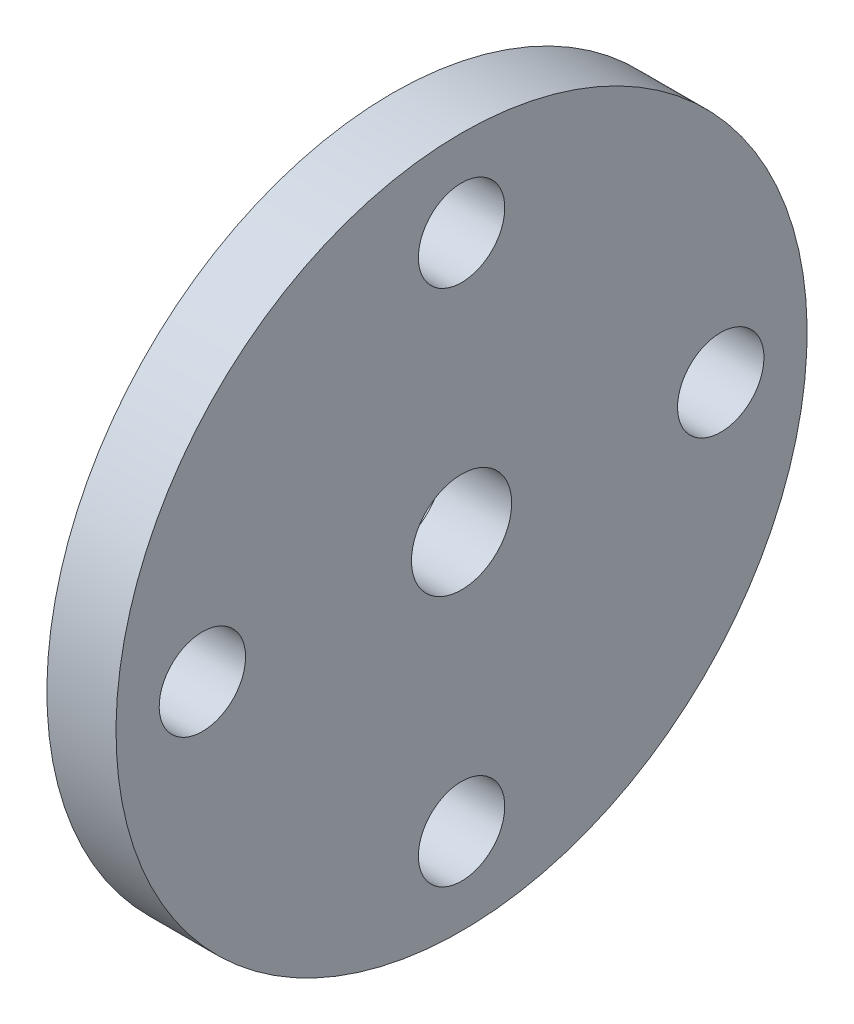
ISO-10303-21;
HEADER;
FILE_DESCRIPTION(('STEP AP214'),'2;1');
FILE_NAME('part.step','',(''),(''),'','','');
FILE_SCHEMA(('AUTOMOTIVE_DESIGN { 1 0 10303 214 1 1 1 1 }'));
ENDSEC;
DATA;
#1=APPLICATION_CONTEXT('core data for automotive mechanical design processes');
#2=APPLICATION_PROTOCOL_DEFINITION('international standard','automotive_design',2000,#1);
#3=PRODUCT_CONTEXT('',#1,'mechanical');
#4=PRODUCT('Part','Part','',(#3));
#5=PRODUCT_RELATED_PRODUCT_CATEGORY('part','',(#4));
#6=PRODUCT_DEFINITION_FORMATION('','',#4);
#7=PRODUCT_DEFINITION_CONTEXT('part definition',#1,'design');
#8=PRODUCT_DEFINITION('design','',#6,#7);
#9=PRODUCT_DEFINITION_SHAPE('','',#8);
#10=(LENGTH_UNIT() NAMED_UNIT(*) SI_UNIT(.MILLI.,.METRE.));
#11=(NAMED_UNIT(*) PLANE_ANGLE_UNIT() SI_UNIT($,.RADIAN.));
#12=(NAMED_UNIT(*) SI_UNIT($,.STERADIAN.) SOLID_ANGLE_UNIT());
#13=UNCERTAINTY_MEASURE_WITH_UNIT(LENGTH_MEASURE(1.E-05),#10,'distance_accuracy_value','');
#14=(GEOMETRIC_REPRESENTATION_CONTEXT(3) GLOBAL_UNCERTAINTY_ASSIGNED_CONTEXT((#13)) GLOBAL_UNIT_ASSIGNED_CONTEXT((#10,
#11,#12)) REPRESENTATION_CONTEXT('',''));
#15=CARTESIAN_POINT('',(0.,0.,0.));
#16=DIRECTION('',(0.,0.,1.));
#17=DIRECTION('',(1.,0.,0.));
#18=AXIS2_PLACEMENT_3D('',#15,#16,#17);
#19=CARTESIAN_POINT('',(5.,0.,0.));
#20=DIRECTION('',(1.,0.,0.));
#21=DIRECTION('',(0.,1.,0.));
#22=AXIS2_PLACEMENT_3D('',#19,#20,#21);
#23=CYLINDRICAL_SURFACE('',#22,4.7);
#24=CARTESIAN_POINT('',(0.,0.,0.));
#25=DIRECTION('',(1.,0.,0.));
#26=DIRECTION('',(0.,1.,0.));
#27=AXIS2_PLACEMENT_3D('',#24,#25,#26);
#28=CIRCLE('',#27,4.7);
#29=CARTESIAN_POINT('',(0.,4.7,0.));
#30=VERTEX_POINT('',#29);
#31=EDGE_CURVE('E10',#30,#30,#28,.T.);
#32=ORIENTED_EDGE('',*,*,#31,.T.);
#33=EDGE_LOOP('',(#32));
#34=FACE_BOUND('',#33,.T.);
#35=CARTESIAN_POINT('',(3.,0.,0.));
#36=DIRECTION('',(1.,0.,0.));
#37=DIRECTION('',(0.,1.,0.));
#38=AXIS2_PLACEMENT_3D('',#35,#36,#37);
#39=CIRCLE('',#38,4.7);
#40=CARTESIAN_POINT('',(3.,4.7,0.));
#41=VERTEX_POINT('',#40);
#42=EDGE_CURVE('E62',#41,#41,#39,.T.);
#43=ORIENTED_EDGE('',*,*,#42,.F.);
#44=EDGE_LOOP('',(#43));
#45=FACE_BOUND('',#44,.T.);
#46=ADVANCED_FACE('F31',(#34,#45),#23,.T.);
#47=CARTESIAN_POINT('',(0.,3.,0.));
#48=DIRECTION('',(-1.,0.,0.));
#49=DIRECTION('',(0.,-1.,0.));
#50=AXIS2_PLACEMENT_3D('',#47,#48,#49);
#51=PLANE('',#50);
#52=CARTESIAN_POINT('',(0.,0.,0.));
#53=DIRECTION('',(1.,0.,0.));
#54=DIRECTION('',(0.,1.,0.));
#55=AXIS2_PLACEMENT_3D('',#52,#53,#54);
#56=CIRCLE('',#55,3.);
#57=CARTESIAN_POINT('',(0.,3.,0.));
#58=VERTEX_POINT('',#57);
#59=EDGE_CURVE('E38',#58,#58,#56,.T.);
#60=ORIENTED_EDGE('',*,*,#59,.T.);
#61=EDGE_LOOP('',(#60));
#62=FACE_BOUND('',#61,.T.);
#63=ORIENTED_EDGE('',*,*,#31,.F.);
#64=EDGE_LOOP('',(#63));
#65=FACE_BOUND('',#64,.T.);
#66=ADVANCED_FACE('F94',(#62,#65),#51,.T.);
#67=CARTESIAN_POINT('',(5.,0.,0.));
#68=DIRECTION('',(1.,0.,0.));
#69=DIRECTION('',(0.,1.,0.));
#70=AXIS2_PLACEMENT_3D('',#67,#68,#69);
#71=CYLINDRICAL_SURFACE('',#70,3.);
#72=CARTESIAN_POINT('',(3.,0.,0.));
#73=DIRECTION('',(1.,0.,0.));
#74=DIRECTION('',(0.,1.,0.));
#75=AXIS2_PLACEMENT_3D('',#72,#73,#74);
#76=CIRCLE('',#75,3.);
#77=CARTESIAN_POINT('',(3.,3.,0.));
#78=VERTEX_POINT('',#77);
#79=EDGE_CURVE('E43',#78,#78,#76,.T.);
#80=ORIENTED_EDGE('',*,*,#79,.T.);
#81=EDGE_LOOP('',(#80));
#82=FACE_BOUND('',#81,.T.);
#83=ORIENTED_EDGE('',*,*,#59,.F.);
#84=EDGE_LOOP('',(#83));
#85=FACE_BOUND('',#84,.T.);
#86=ADVANCED_FACE('F79',(#82,#85),#71,.F.);
#87=CARTESIAN_POINT('',(3.,3.,0.));
#88=DIRECTION('',(-1.,0.,0.));
#89=DIRECTION('',(0.,-1.,0.));
#90=AXIS2_PLACEMENT_3D('',#87,#88,#89);
#91=PLANE('',#90);
#92=CARTESIAN_POINT('',(3.,0.,0.));
#93=DIRECTION('',(-1.,0.,0.));
#94=DIRECTION('',(0.,-1.,0.));
#95=AXIS2_PLACEMENT_3D('',#92,#93,#94);
#96=CIRCLE('',#95,1.45);
#97=CARTESIAN_POINT('',(3.,-1.45,0.));
#98=VERTEX_POINT('',#97);
#99=EDGE_CURVE('E58',#98,#98,#96,.T.);
#100=ORIENTED_EDGE('',*,*,#99,.F.);
#101=EDGE_LOOP('',(#100));
#102=FACE_BOUND('',#101,.T.);
#103=ORIENTED_EDGE('',*,*,#79,.F.);
#104=EDGE_LOOP('',(#103));
#105=FACE_BOUND('',#104,.T.);
#106=ADVANCED_FACE('F82',(#102,#105),#91,.T.);
#107=CARTESIAN_POINT('',(5.,10.,0.));
#108=DIRECTION('',(1.,0.,0.));
#109=DIRECTION('',(0.,1.,0.));
#110=AXIS2_PLACEMENT_3D('',#107,#108,#109);
#111=PLANE('',#110);
#112=CARTESIAN_POINT('',(5.,7.5,0.));
#113=DIRECTION('',(1.,0.,0.));
#114=DIRECTION('',(0.,1.,0.));
#115=AXIS2_PLACEMENT_3D('',#112,#113,#114);
#116=CIRCLE('',#115,1.25);
#117=CARTESIAN_POINT('',(5.,8.75,0.));
#118=VERTEX_POINT('',#117);
#119=EDGE_CURVE('E147',#118,#118,#116,.T.);
#120=ORIENTED_EDGE('',*,*,#119,.F.);
#121=EDGE_LOOP('',(#120));
#122=FACE_BOUND('',#121,.T.);
#123=CARTESIAN_POINT('',(5.,2.13328537801155E-13,-7.50000000000021));
#124=DIRECTION('',(1.,0.,0.));
#125=DIRECTION('',(0.,1.,0.));
#126=AXIS2_PLACEMENT_3D('',#123,#124,#125);
#127=CIRCLE('',#126,1.25000000000017);
#128=CARTESIAN_POINT('',(5.,1.25000000000038,-7.50000000000021));
#129=VERTEX_POINT('',#128);
#130=EDGE_CURVE('E143',#129,#129,#127,.T.);
#131=ORIENTED_EDGE('',*,*,#130,.F.);
#132=EDGE_LOOP('',(#131));
#133=FACE_BOUND('',#132,.T.);
#134=CARTESIAN_POINT('',(5.,-7.5,-4.24488671257339E-13));
#135=DIRECTION('',(1.,0.,0.));
#136=DIRECTION('',(0.,1.,0.));
#137=AXIS2_PLACEMENT_3D('',#134,#135,#136);
#138=CIRCLE('',#137,1.25000000000046);
#139=CARTESIAN_POINT('',(5.,-6.24999999999954,-4.24488671257339E-13));
#140=VERTEX_POINT('',#139);
#141=EDGE_CURVE('E141',#140,#140,#138,.T.);
#142=ORIENTED_EDGE('',*,*,#141,.F.);
#143=EDGE_LOOP('',(#142));
#144=FACE_BOUND('',#143,.T.);
#145=CARTESIAN_POINT('',(5.,-2.12078618555545E-13,7.49999999999979));
#146=DIRECTION('',(1.,0.,0.));
#147=DIRECTION('',(0.,1.,0.));
#148=AXIS2_PLACEMENT_3D('',#145,#146,#147);
#149=CIRCLE('',#148,1.25000000000034);
#150=CARTESIAN_POINT('',(5.,1.25000000000013,7.49999999999979));
#151=VERTEX_POINT('',#150);
#152=EDGE_CURVE('E144',#151,#151,#149,.T.);
#153=ORIENTED_EDGE('',*,*,#152,.F.);
#154=EDGE_LOOP('',(#153));
#155=FACE_BOUND('',#154,.T.);
#156=CARTESIAN_POINT('',(5.,0.,0.));
#157=DIRECTION('',(1.,0.,0.));
#158=DIRECTION('',(0.,1.,0.));
#159=AXIS2_PLACEMENT_3D('',#156,#157,#158);
#160=CIRCLE('',#159,1.45);
#161=CARTESIAN_POINT('',(5.,1.45,0.));
#162=VERTEX_POINT('',#161);
#163=EDGE_CURVE('E51',#162,#162,#160,.T.);
#164=ORIENTED_EDGE('',*,*,#163,.F.);
#165=EDGE_LOOP('',(#164));
#166=FACE_BOUND('',#165,.T.);
#167=CARTESIAN_POINT('',(5.,0.,0.));
#168=DIRECTION('',(1.,0.,0.));
#169=DIRECTION('',(0.,1.,0.));
#170=AXIS2_PLACEMENT_3D('',#167,#168,#169);
#171=CIRCLE('',#170,10.);
#172=CARTESIAN_POINT('',(5.,10.,0.));
#173=VERTEX_POINT('',#172);
#174=EDGE_CURVE('E74',#173,#173,#171,.T.);
#175=ORIENTED_EDGE('',*,*,#174,.T.);
#176=EDGE_LOOP('',(#175));
#177=FACE_BOUND('',#176,.T.);
#178=ADVANCED_FACE('F84',(#122,#133,#144,#155,#166,#177),#111,.T.);
#179=CARTESIAN_POINT('',(5.,0.,0.));
#180=DIRECTION('',(1.,0.,0.));
#181=DIRECTION('',(0.,1.,0.));
#182=AXIS2_PLACEMENT_3D('',#179,#180,#181);
#183=CYLINDRICAL_SURFACE('',#182,10.);
#184=CARTESIAN_POINT('',(3.,0.,0.));
#185=DIRECTION('',(1.,0.,0.));
#186=DIRECTION('',(0.,1.,0.));
#187=AXIS2_PLACEMENT_3D('',#184,#185,#186);
#188=CIRCLE('',#187,10.);
#189=CARTESIAN_POINT('',(3.,10.,0.));
#190=VERTEX_POINT('',#189);
#191=EDGE_CURVE('E67',#190,#190,#188,.T.);
#192=ORIENTED_EDGE('',*,*,#191,.T.);
#193=EDGE_LOOP('',(#192));
#194=FACE_BOUND('',#193,.T.);
#195=ORIENTED_EDGE('',*,*,#174,.F.);
#196=EDGE_LOOP('',(#195));
#197=FACE_BOUND('',#196,.T.);
#198=ADVANCED_FACE('F91',(#194,#197),#183,.T.);
#199=CARTESIAN_POINT('',(3.,4.7,0.));
#200=DIRECTION('',(-1.,0.,0.));
#201=DIRECTION('',(0.,-1.,0.));
#202=AXIS2_PLACEMENT_3D('',#199,#200,#201);
#203=PLANE('',#202);
#204=CARTESIAN_POINT('',(3.,7.5,0.));
#205=DIRECTION('',(-1.,0.,0.));
#206=DIRECTION('',(0.,-1.,0.));
#207=AXIS2_PLACEMENT_3D('',#204,#205,#206);
#208=CIRCLE('',#207,1.25);
#209=CARTESIAN_POINT('',(3.,6.25,0.));
#210=VERTEX_POINT('',#209);
#211=EDGE_CURVE('E34',#210,#210,#208,.T.);
#212=ORIENTED_EDGE('',*,*,#211,.F.);
#213=EDGE_LOOP('',(#212));
#214=FACE_BOUND('',#213,.T.);
#215=CARTESIAN_POINT('',(3.,2.12894856932161E-13,-7.50000000000021));
#216=DIRECTION('',(-1.,0.,0.));
#217=DIRECTION('',(0.,-1.,0.));
#218=AXIS2_PLACEMENT_3D('',#215,#216,#217);
#219=CIRCLE('',#218,1.25000000000017);
#220=CARTESIAN_POINT('',(3.,-1.24999999999995,-7.50000000000021));
#221=VERTEX_POINT('',#220);
#222=EDGE_CURVE('E53',#221,#221,#219,.T.);
#223=ORIENTED_EDGE('',*,*,#222,.F.);
#224=EDGE_LOOP('',(#223));
#225=FACE_BOUND('',#224,.T.);
#226=CARTESIAN_POINT('',(3.,-7.5,-4.24488671257339E-13));
#227=DIRECTION('',(-1.,0.,0.));
#228=DIRECTION('',(0.,-1.,0.));
#229=AXIS2_PLACEMENT_3D('',#226,#227,#228);
#230=CIRCLE('',#229,1.25000000000046);
#231=CARTESIAN_POINT('',(3.,-8.75000000000045,-4.24488671257339E-13));
#232=VERTEX_POINT('',#231);
#233=EDGE_CURVE('E50',#232,#232,#230,.T.);
#234=ORIENTED_EDGE('',*,*,#233,.F.);
#235=EDGE_LOOP('',(#234));
#236=FACE_BOUND('',#235,.T.);
#237=CARTESIAN_POINT('',(3.,-2.12512299424539E-13,7.49999999999979));
#238=DIRECTION('',(-1.,0.,0.));
#239=DIRECTION('',(0.,-1.,0.));
#240=AXIS2_PLACEMENT_3D('',#237,#238,#239);
#241=CIRCLE('',#240,1.25000000000034);
#242=CARTESIAN_POINT('',(3.,-1.25000000000055,7.49999999999979));
#243=VERTEX_POINT('',#242);
#244=EDGE_CURVE('E47',#243,#243,#241,.T.);
#245=ORIENTED_EDGE('',*,*,#244,.F.);
#246=EDGE_LOOP('',(#245));
#247=FACE_BOUND('',#246,.T.);
#248=ORIENTED_EDGE('',*,*,#42,.T.);
#249=EDGE_LOOP('',(#248));
#250=FACE_BOUND('',#249,.T.);
#251=ORIENTED_EDGE('',*,*,#191,.F.);
#252=EDGE_LOOP('',(#251));
#253=FACE_BOUND('',#252,.T.);
#254=ADVANCED_FACE('F104',(#214,#225,#236,#247,#250,#253),#203,.T.);
#255=CARTESIAN_POINT('',(-5.,-2.14247022900516E-13,7.49999999999979));
#256=DIRECTION('',(1.,0.,0.));
#257=DIRECTION('',(0.,1.,0.));
#258=AXIS2_PLACEMENT_3D('',#255,#256,#257);
#259=CYLINDRICAL_SURFACE('',#258,1.25000000000034);
#260=ORIENTED_EDGE('',*,*,#244,.T.);
#261=EDGE_LOOP('',(#260));
#262=FACE_BOUND('',#261,.T.);
#263=ORIENTED_EDGE('',*,*,#152,.T.);
#264=EDGE_LOOP('',(#263));
#265=FACE_BOUND('',#264,.T.);
#266=ADVANCED_FACE('F107',(#262,#265),#259,.F.);
#267=CARTESIAN_POINT('',(-5.,-7.5,-4.24488671257339E-13));
#268=DIRECTION('',(1.,0.,0.));
#269=DIRECTION('',(0.,1.,0.));
#270=AXIS2_PLACEMENT_3D('',#267,#268,#269);
#271=CYLINDRICAL_SURFACE('',#270,1.25000000000046);
#272=ORIENTED_EDGE('',*,*,#233,.T.);
#273=EDGE_LOOP('',(#272));
#274=FACE_BOUND('',#273,.T.);
#275=ORIENTED_EDGE('',*,*,#141,.T.);
#276=EDGE_LOOP('',(#275));
#277=FACE_BOUND('',#276,.T.);
#278=ADVANCED_FACE('F127',(#274,#277),#271,.F.);
#279=CARTESIAN_POINT('',(-5.,2.11160133456184E-13,-7.50000000000021));
#280=DIRECTION('',(1.,0.,0.));
#281=DIRECTION('',(0.,1.,0.));
#282=AXIS2_PLACEMENT_3D('',#279,#280,#281);
#283=CYLINDRICAL_SURFACE('',#282,1.25000000000017);
#284=ORIENTED_EDGE('',*,*,#222,.T.);
#285=EDGE_LOOP('',(#284));
#286=FACE_BOUND('',#285,.T.);
#287=ORIENTED_EDGE('',*,*,#130,.T.);
#288=EDGE_LOOP('',(#287));
#289=FACE_BOUND('',#288,.T.);
#290=ADVANCED_FACE('F124',(#286,#289),#283,.F.);
#291=CARTESIAN_POINT('',(-5.,7.5,0.));
#292=DIRECTION('',(1.,0.,0.));
#293=DIRECTION('',(0.,1.,0.));
#294=AXIS2_PLACEMENT_3D('',#291,#292,#293);
#295=CYLINDRICAL_SURFACE('',#294,1.25);
#296=ORIENTED_EDGE('',*,*,#211,.T.);
#297=EDGE_LOOP('',(#296));
#298=FACE_BOUND('',#297,.T.);
#299=ORIENTED_EDGE('',*,*,#119,.T.);
#300=EDGE_LOOP('',(#299));
#301=FACE_BOUND('',#300,.T.);
#302=ADVANCED_FACE('F123',(#298,#301),#295,.F.);
#303=CARTESIAN_POINT('',(-5.,0.,0.));
#304=DIRECTION('',(1.,0.,0.));
#305=DIRECTION('',(0.,1.,0.));
#306=AXIS2_PLACEMENT_3D('',#303,#304,#305);
#307=CYLINDRICAL_SURFACE('',#306,1.45);
#308=ORIENTED_EDGE('',*,*,#99,.T.);
#309=EDGE_LOOP('',(#308));
#310=FACE_BOUND('',#309,.T.);
#311=ORIENTED_EDGE('',*,*,#163,.T.);
#312=EDGE_LOOP('',(#311));
#313=FACE_BOUND('',#312,.T.);
#314=ADVANCED_FACE('F120',(#310,#313),#307,.F.);
#315=CLOSED_SHELL('',(#46,#66,#86,#106,#178,#198,#254,#266,#278,#290,#302,#314));
#316=MANIFOLD_SOLID_BREP('B2',#315);
#317=ADVANCED_BREP_SHAPE_REPRESENTATION('',(#18,#316),#14);
#318=SHAPE_DEFINITION_REPRESENTATION(#9,#317);
ENDSEC;
END-ISO-10303-21;
